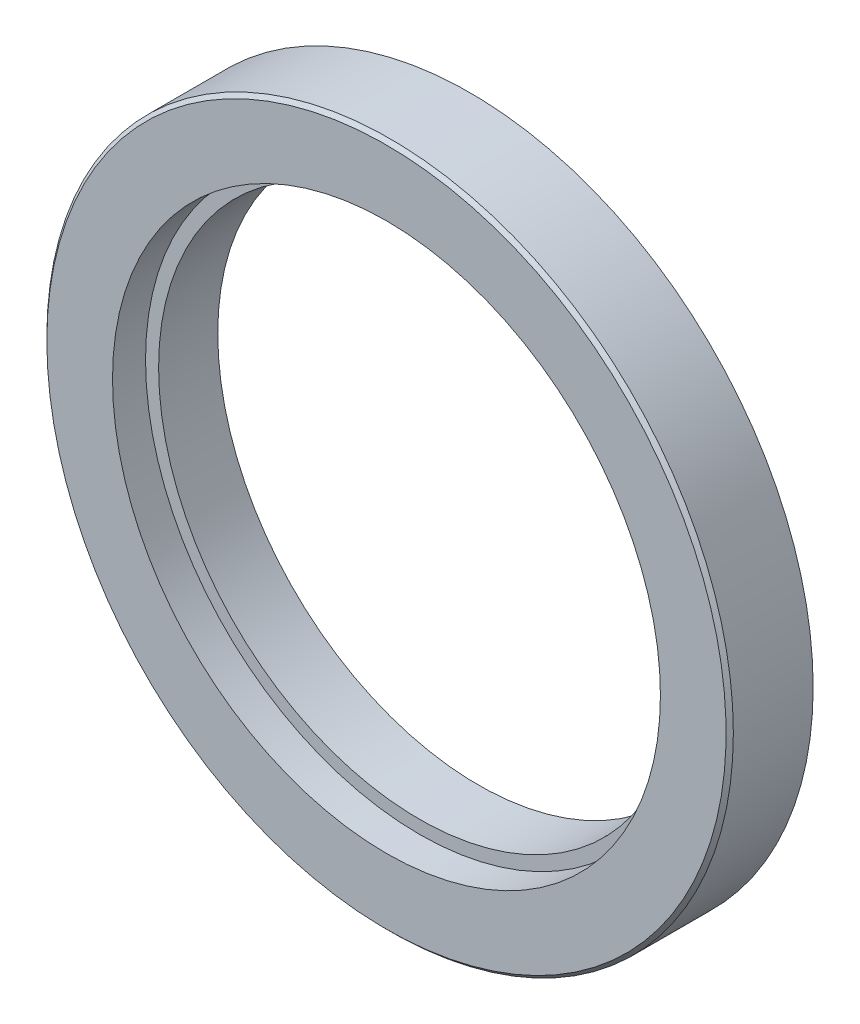
ISO-10303-21;
HEADER;
FILE_DESCRIPTION(('STEP AP214'),'2;1');
FILE_NAME('part.step','',(''),(''),'','','');
FILE_SCHEMA(('AUTOMOTIVE_DESIGN { 1 0 10303 214 1 1 1 1 }'));
ENDSEC;
DATA;
#1=APPLICATION_CONTEXT('core data for automotive mechanical design processes');
#2=APPLICATION_PROTOCOL_DEFINITION('international standard','automotive_design',2000,#1);
#3=PRODUCT_CONTEXT('',#1,'mechanical');
#4=PRODUCT('Part','Part','',(#3));
#5=PRODUCT_RELATED_PRODUCT_CATEGORY('part','',(#4));
#6=PRODUCT_DEFINITION_FORMATION('','',#4);
#7=PRODUCT_DEFINITION_CONTEXT('part definition',#1,'design');
#8=PRODUCT_DEFINITION('design','',#6,#7);
#9=PRODUCT_DEFINITION_SHAPE('','',#8);
#10=(LENGTH_UNIT() NAMED_UNIT(*) SI_UNIT(.MILLI.,.METRE.));
#11=(NAMED_UNIT(*) PLANE_ANGLE_UNIT() SI_UNIT($,.RADIAN.));
#12=(NAMED_UNIT(*) SI_UNIT($,.STERADIAN.) SOLID_ANGLE_UNIT());
#13=UNCERTAINTY_MEASURE_WITH_UNIT(LENGTH_MEASURE(1.E-05),#10,'distance_accuracy_value','');
#14=(GEOMETRIC_REPRESENTATION_CONTEXT(3) GLOBAL_UNCERTAINTY_ASSIGNED_CONTEXT((#13)) GLOBAL_UNIT_ASSIGNED_CONTEXT((#10,
#11,#12)) REPRESENTATION_CONTEXT('',''));
#15=CARTESIAN_POINT('',(0.,0.,0.));
#16=DIRECTION('',(0.,0.,1.));
#17=DIRECTION('',(1.,0.,0.));
#18=AXIS2_PLACEMENT_3D('',#15,#16,#17);
#19=CARTESIAN_POINT('',(0.,124.,-117.490200000015));
#20=DIRECTION('',(0.,0.,-1.));
#21=DIRECTION('',(-1.,0.,0.));
#22=AXIS2_PLACEMENT_3D('',#19,#20,#21);
#23=CONICAL_SURFACE('',#22,20.9105557589292,0.0872664626057299);
#24=CARTESIAN_POINT('',(0.,124.,-117.998200000038));
#25=DIRECTION('',(0.,0.,-1.));
#26=DIRECTION('',(1.,0.,0.));
#27=AXIS2_PLACEMENT_3D('',#24,#25,#26);
#28=CIRCLE('',#27,20.9550000000001);
#29=CARTESIAN_POINT('',(20.9550000000001,124.,-117.998200000038));
#30=VERTEX_POINT('',#29);
#31=EDGE_CURVE('E30',#30,#30,#28,.T.);
#32=ORIENTED_EDGE('',*,*,#31,.T.);
#33=EDGE_LOOP('',(#32));
#34=FACE_BOUND('',#33,.T.);
#35=CARTESIAN_POINT('',(0.,124.,-117.490200000015));
#36=DIRECTION('',(0.,0.,-1.));
#37=DIRECTION('',(-1.,0.,0.));
#38=AXIS2_PLACEMENT_3D('',#35,#36,#37);
#39=CIRCLE('',#38,20.9105557589292);
#40=CARTESIAN_POINT('',(-20.9105557589292,124.,-117.490200000015));
#41=VERTEX_POINT('',#40);
#42=EDGE_CURVE('E18',#41,#41,#39,.T.);
#43=ORIENTED_EDGE('',*,*,#42,.F.);
#44=EDGE_LOOP('',(#43));
#45=FACE_BOUND('',#44,.T.);
#46=ADVANCED_FACE('F14',(#34,#45),#23,.F.);
#47=CARTESIAN_POINT('',(-21.74697798929,145.750939409,-117.4902));
#48=DIRECTION('',(0.,0.,-1.));
#49=DIRECTION('',(1.,0.,0.));
#50=AXIS2_PLACEMENT_3D('',#47,#48,#49);
#51=PLANE('',#50);
#52=CARTESIAN_POINT('',(0.,124.,-117.4902));
#53=DIRECTION('',(0.,0.,1.));
#54=DIRECTION('',(1.,0.,0.));
#55=AXIS2_PLACEMENT_3D('',#52,#53,#54);
#56=CIRCLE('',#55,18.2626);
#57=CARTESIAN_POINT('',(18.2626,124.,-117.4902));
#58=VERTEX_POINT('',#57);
#59=EDGE_CURVE('E39',#58,#58,#56,.F.);
#60=ORIENTED_EDGE('',*,*,#59,.F.);
#61=EDGE_LOOP('',(#60));
#62=FACE_BOUND('',#61,.T.);
#63=ORIENTED_EDGE('',*,*,#42,.T.);
#64=EDGE_LOOP('',(#63));
#65=FACE_BOUND('',#64,.T.);
#66=ADVANCED_FACE('F50',(#62,#65),#51,.T.);
#67=CARTESIAN_POINT('',(0.,124.,-116.879573881962));
#68=DIRECTION('',(0.,0.,1.));
#69=DIRECTION('',(1.,0.,0.));
#70=AXIS2_PLACEMENT_3D('',#67,#68,#69);
#71=CONICAL_SURFACE('',#70,24.0284,1.22173047637214);
#72=ORIENTED_EDGE('',*,*,#31,.F.);
#73=EDGE_LOOP('',(#72));
#74=FACE_BOUND('',#73,.T.);
#75=CARTESIAN_POINT('',(0.,124.,-116.879573881961));
#76=DIRECTION('',(0.,0.,-1.));
#77=DIRECTION('',(-1.,0.,0.));
#78=AXIS2_PLACEMENT_3D('',#75,#76,#77);
#79=CIRCLE('',#78,24.0284);
#80=CARTESIAN_POINT('',(-24.0284,124.,-116.879573881961));
#81=VERTEX_POINT('',#80);
#82=EDGE_CURVE('E38',#81,#81,#79,.T.);
#83=ORIENTED_EDGE('',*,*,#82,.T.);
#84=EDGE_LOOP('',(#83));
#85=FACE_BOUND('',#84,.T.);
#86=ADVANCED_FACE('F58',(#74,#85),#71,.T.);
#87=CARTESIAN_POINT('',(0.,124.,-117.4902));
#88=DIRECTION('',(0.,0.,1.));
#89=DIRECTION('',(1.,0.,0.));
#90=AXIS2_PLACEMENT_3D('',#87,#88,#89);
#91=CYLINDRICAL_SURFACE('',#90,18.2626);
#92=ORIENTED_EDGE('',*,*,#59,.T.);
#93=EDGE_LOOP('',(#92));
#94=FACE_BOUND('',#93,.T.);
#95=CARTESIAN_POINT('',(0.,124.,-113.35));
#96=DIRECTION('',(0.,0.,1.));
#97=DIRECTION('',(1.,0.,0.));
#98=AXIS2_PLACEMENT_3D('',#95,#96,#97);
#99=CIRCLE('',#98,18.2626);
#100=CARTESIAN_POINT('',(18.2626,124.,-113.35));
#101=VERTEX_POINT('',#100);
#102=EDGE_CURVE('E36',#101,#101,#99,.T.);
#103=ORIENTED_EDGE('',*,*,#102,.T.);
#104=EDGE_LOOP('',(#103));
#105=FACE_BOUND('',#104,.T.);
#106=ADVANCED_FACE('F87',(#94,#105),#91,.F.);
#107=CARTESIAN_POINT('',(0.,124.,-111.292600000038));
#108=DIRECTION('',(0.,0.,-1.));
#109=DIRECTION('',(0.,1.,0.));
#110=AXIS2_PLACEMENT_3D('',#107,#108,#109);
#111=CYLINDRICAL_SURFACE('',#110,24.0284);
#112=CARTESIAN_POINT('',(0.,124.,-111.292600000001));
#113=DIRECTION('',(0.,0.,-1.));
#114=DIRECTION('',(-1.,0.,0.));
#115=AXIS2_PLACEMENT_3D('',#112,#113,#114);
#116=CIRCLE('',#115,24.0284000000012);
#117=CARTESIAN_POINT('',(-24.0284000000012,124.,-111.292600000001));
#118=VERTEX_POINT('',#117);
#119=EDGE_CURVE('E35',#118,#118,#116,.T.);
#120=ORIENTED_EDGE('',*,*,#119,.T.);
#121=EDGE_LOOP('',(#120));
#122=FACE_BOUND('',#121,.T.);
#123=ORIENTED_EDGE('',*,*,#82,.F.);
#124=EDGE_LOOP('',(#123));
#125=FACE_BOUND('',#124,.T.);
#126=ADVANCED_FACE('F81',(#122,#125),#111,.T.);
#127=CARTESIAN_POINT('',(-19.94408,143.94408,-113.35));
#128=DIRECTION('',(0.,0.,-1.));
#129=DIRECTION('',(1.,0.,0.));
#130=AXIS2_PLACEMENT_3D('',#127,#128,#129);
#131=PLANE('',#130);
#132=ORIENTED_EDGE('',*,*,#102,.F.);
#133=EDGE_LOOP('',(#132));
#134=FACE_BOUND('',#133,.T.);
#135=CARTESIAN_POINT('',(0.,124.,-113.35));
#136=DIRECTION('',(0.,0.,-1.));
#137=DIRECTION('',(0.,1.,0.));
#138=AXIS2_PLACEMENT_3D('',#135,#136,#137);
#139=CIRCLE('',#138,19.177);
#140=CARTESIAN_POINT('',(0.,143.177,-113.35));
#141=VERTEX_POINT('',#140);
#142=EDGE_CURVE('E27',#141,#141,#139,.T.);
#143=ORIENTED_EDGE('',*,*,#142,.F.);
#144=EDGE_LOOP('',(#143));
#145=FACE_BOUND('',#144,.T.);
#146=ADVANCED_FACE('F75',(#134,#145),#131,.F.);
#147=CARTESIAN_POINT('',(0.,124.,-111.038599999999));
#148=DIRECTION('',(0.,0.,-1.));
#149=DIRECTION('',(-1.,0.,0.));
#150=AXIS2_PLACEMENT_3D('',#147,#148,#149);
#151=CONICAL_SURFACE('',#150,23.7743999999988,0.785398163397448);
#152=ORIENTED_EDGE('',*,*,#119,.F.);
#153=EDGE_LOOP('',(#152));
#154=FACE_BOUND('',#153,.T.);
#155=CARTESIAN_POINT('',(0.,124.,-111.038599999999));
#156=DIRECTION('',(0.,0.,-1.));
#157=DIRECTION('',(-1.,0.,0.));
#158=AXIS2_PLACEMENT_3D('',#155,#156,#157);
#159=CIRCLE('',#158,23.7743999999988);
#160=CARTESIAN_POINT('',(-23.7743999999988,124.,-111.038599999999));
#161=VERTEX_POINT('',#160);
#162=EDGE_CURVE('E22',#161,#161,#159,.T.);
#163=ORIENTED_EDGE('',*,*,#162,.T.);
#164=EDGE_LOOP('',(#163));
#165=FACE_BOUND('',#164,.T.);
#166=ADVANCED_FACE('F68',(#154,#165),#151,.T.);
#167=CARTESIAN_POINT('',(0.,124.,-111.0386));
#168=DIRECTION('',(0.,0.,-1.));
#169=DIRECTION('',(0.,1.,0.));
#170=AXIS2_PLACEMENT_3D('',#167,#168,#169);
#171=CYLINDRICAL_SURFACE('',#170,19.177);
#172=ORIENTED_EDGE('',*,*,#142,.T.);
#173=EDGE_LOOP('',(#172));
#174=FACE_BOUND('',#173,.T.);
#175=CARTESIAN_POINT('',(0.,124.,-111.0386));
#176=DIRECTION('',(0.,0.,-1.));
#177=DIRECTION('',(0.,1.,0.));
#178=AXIS2_PLACEMENT_3D('',#175,#176,#177);
#179=CIRCLE('',#178,19.177);
#180=CARTESIAN_POINT('',(0.,143.177,-111.0386));
#181=VERTEX_POINT('',#180);
#182=EDGE_CURVE('E10',#181,#181,#179,.F.);
#183=ORIENTED_EDGE('',*,*,#182,.T.);
#184=EDGE_LOOP('',(#183));
#185=FACE_BOUND('',#184,.T.);
#186=ADVANCED_FACE('F63',(#174,#185),#171,.F.);
#187=CARTESIAN_POINT('',(24.725376,99.274624,-111.0386));
#188=DIRECTION('',(0.,0.,-1.));
#189=DIRECTION('',(-1.,0.,0.));
#190=AXIS2_PLACEMENT_3D('',#187,#188,#189);
#191=PLANE('',#190);
#192=ORIENTED_EDGE('',*,*,#182,.F.);
#193=EDGE_LOOP('',(#192));
#194=FACE_BOUND('',#193,.T.);
#195=ORIENTED_EDGE('',*,*,#162,.F.);
#196=EDGE_LOOP('',(#195));
#197=FACE_BOUND('',#196,.T.);
#198=ADVANCED_FACE('F16',(#194,#197),#191,.F.);
#199=CLOSED_SHELL('',(#46,#66,#86,#106,#126,#146,#166,#186,#198));
#200=MANIFOLD_SOLID_BREP('B1',#199);
#201=ADVANCED_BREP_SHAPE_REPRESENTATION('',(#18,#200),#14);
#202=SHAPE_DEFINITION_REPRESENTATION(#9,#201);
ENDSEC;
END-ISO-10303-21;
